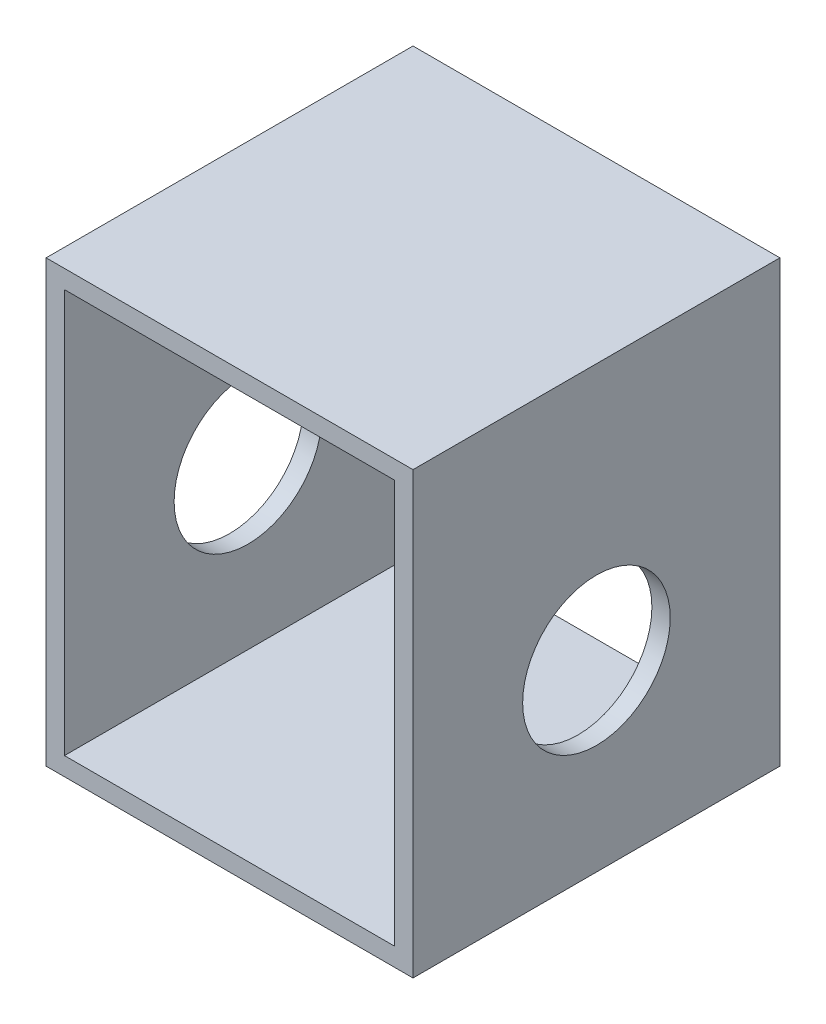
ISO-10303-21;
HEADER;
FILE_DESCRIPTION(('STEP AP214'),'2;1');
FILE_NAME('part.step','',(''),(''),'','','');
FILE_SCHEMA(('AUTOMOTIVE_DESIGN { 1 0 10303 214 1 1 1 1 }'));
ENDSEC;
DATA;
#1=APPLICATION_CONTEXT('core data for automotive mechanical design processes');
#2=APPLICATION_PROTOCOL_DEFINITION('international standard','automotive_design',2000,#1);
#3=PRODUCT_CONTEXT('',#1,'mechanical');
#4=PRODUCT('Part','Part','',(#3));
#5=PRODUCT_RELATED_PRODUCT_CATEGORY('part','',(#4));
#6=PRODUCT_DEFINITION_FORMATION('','',#4);
#7=PRODUCT_DEFINITION_CONTEXT('part definition',#1,'design');
#8=PRODUCT_DEFINITION('design','',#6,#7);
#9=PRODUCT_DEFINITION_SHAPE('','',#8);
#10=(LENGTH_UNIT() NAMED_UNIT(*) SI_UNIT(.MILLI.,.METRE.));
#11=(NAMED_UNIT(*) PLANE_ANGLE_UNIT() SI_UNIT($,.RADIAN.));
#12=(NAMED_UNIT(*) SI_UNIT($,.STERADIAN.) SOLID_ANGLE_UNIT());
#13=UNCERTAINTY_MEASURE_WITH_UNIT(LENGTH_MEASURE(1.E-05),#10,'distance_accuracy_value','');
#14=(GEOMETRIC_REPRESENTATION_CONTEXT(3) GLOBAL_UNCERTAINTY_ASSIGNED_CONTEXT((#13)) GLOBAL_UNIT_ASSIGNED_CONTEXT((#10,
#11,#12)) REPRESENTATION_CONTEXT('',''));
#15=CARTESIAN_POINT('',(0.,0.,0.));
#16=DIRECTION('',(0.,0.,1.));
#17=DIRECTION('',(1.,0.,0.));
#18=AXIS2_PLACEMENT_3D('',#15,#16,#17);
#19=CARTESIAN_POINT('',(0.,0.,63.5));
#20=DIRECTION('',(0.,0.,-1.));
#21=DIRECTION('',(-1.,0.,0.));
#22=AXIS2_PLACEMENT_3D('',#19,#20,#21);
#23=PLANE('',#22);
#24=DIRECTION('',(0.,-1.,0.));
#25=VECTOR('',#24,1.);
#26=CARTESIAN_POINT('',(0.,0.,63.5));
#27=LINE('',#26,#25);
#28=CARTESIAN_POINT('',(0.,76.2,63.5));
#29=VERTEX_POINT('',#28);
#30=CARTESIAN_POINT('',(0.,0.,63.5));
#31=VERTEX_POINT('',#30);
#32=EDGE_CURVE('E156',#29,#31,#27,.T.);
#33=ORIENTED_EDGE('',*,*,#32,.T.);
#34=DIRECTION('',(1.,0.,0.));
#35=VECTOR('',#34,1.);
#36=CARTESIAN_POINT('',(0.,0.,63.5));
#37=LINE('',#36,#35);
#38=CARTESIAN_POINT('',(63.5,0.,63.5));
#39=VERTEX_POINT('',#38);
#40=EDGE_CURVE('E160',#31,#39,#37,.T.);
#41=ORIENTED_EDGE('',*,*,#40,.T.);
#42=DIRECTION('',(0.,1.,0.));
#43=VECTOR('',#42,1.);
#44=CARTESIAN_POINT('',(63.5,0.,63.5));
#45=LINE('',#44,#43);
#46=CARTESIAN_POINT('',(63.5,76.2,63.5));
#47=VERTEX_POINT('',#46);
#48=EDGE_CURVE('E164',#39,#47,#45,.T.);
#49=ORIENTED_EDGE('',*,*,#48,.T.);
#50=DIRECTION('',(-1.,0.,0.));
#51=VECTOR('',#50,1.);
#52=CARTESIAN_POINT('',(0.,76.2,63.5));
#53=LINE('',#52,#51);
#54=EDGE_CURVE('E167',#47,#29,#53,.T.);
#55=ORIENTED_EDGE('',*,*,#54,.T.);
#56=EDGE_LOOP('',(#33,#41,#49,#55));
#57=FACE_BOUND('',#56,.T.);
#58=DIRECTION('',(0.,-1.,0.));
#59=VECTOR('',#58,1.);
#60=CARTESIAN_POINT('',(3.175,73.025,63.5));
#61=LINE('',#60,#59);
#62=CARTESIAN_POINT('',(3.175,73.025,63.5));
#63=VERTEX_POINT('',#62);
#64=CARTESIAN_POINT('',(3.17500000000001,3.175,63.5));
#65=VERTEX_POINT('',#64);
#66=EDGE_CURVE('E106',#63,#65,#61,.T.);
#67=ORIENTED_EDGE('',*,*,#66,.F.);
#68=DIRECTION('',(-1.,0.,0.));
#69=VECTOR('',#68,1.);
#70=CARTESIAN_POINT('',(3.175,73.025,63.5));
#71=LINE('',#70,#69);
#72=CARTESIAN_POINT('',(60.325,73.025,63.5));
#73=VERTEX_POINT('',#72);
#74=EDGE_CURVE('E132',#73,#63,#71,.T.);
#75=ORIENTED_EDGE('',*,*,#74,.F.);
#76=DIRECTION('',(0.,1.,0.));
#77=VECTOR('',#76,1.);
#78=CARTESIAN_POINT('',(60.325,73.025,63.5));
#79=LINE('',#78,#77);
#80=CARTESIAN_POINT('',(60.325,3.175,63.5));
#81=VERTEX_POINT('',#80);
#82=EDGE_CURVE('E128',#81,#73,#79,.T.);
#83=ORIENTED_EDGE('',*,*,#82,.F.);
#84=DIRECTION('',(1.,0.,0.));
#85=VECTOR('',#84,1.);
#86=CARTESIAN_POINT('',(3.17500000000001,3.175,63.5));
#87=LINE('',#86,#85);
#88=EDGE_CURVE('E115',#65,#81,#87,.T.);
#89=ORIENTED_EDGE('',*,*,#88,.F.);
#90=EDGE_LOOP('',(#67,#75,#83,#89));
#91=FACE_BOUND('',#90,.T.);
#92=ADVANCED_FACE('F39',(#57,#91),#23,.F.);
#93=CARTESIAN_POINT('',(0.,0.,0.));
#94=DIRECTION('',(0.,0.,-1.));
#95=DIRECTION('',(-1.,0.,0.));
#96=AXIS2_PLACEMENT_3D('',#93,#94,#95);
#97=PLANE('',#96);
#98=DIRECTION('',(0.,-1.,0.));
#99=VECTOR('',#98,1.);
#100=CARTESIAN_POINT('',(0.,0.,0.));
#101=LINE('',#100,#99);
#102=CARTESIAN_POINT('',(0.,76.2,0.));
#103=VERTEX_POINT('',#102);
#104=CARTESIAN_POINT('',(0.,0.,0.));
#105=VERTEX_POINT('',#104);
#106=EDGE_CURVE('E124',#103,#105,#101,.T.);
#107=ORIENTED_EDGE('',*,*,#106,.F.);
#108=DIRECTION('',(-1.,0.,0.));
#109=VECTOR('',#108,1.);
#110=CARTESIAN_POINT('',(0.,76.2,0.));
#111=LINE('',#110,#109);
#112=CARTESIAN_POINT('',(63.5,76.2,0.));
#113=VERTEX_POINT('',#112);
#114=EDGE_CURVE('E161',#113,#103,#111,.T.);
#115=ORIENTED_EDGE('',*,*,#114,.F.);
#116=DIRECTION('',(0.,1.,0.));
#117=VECTOR('',#116,1.);
#118=CARTESIAN_POINT('',(63.5,0.,0.));
#119=LINE('',#118,#117);
#120=CARTESIAN_POINT('',(63.5,0.,0.));
#121=VERTEX_POINT('',#120);
#122=EDGE_CURVE('E177',#121,#113,#119,.T.);
#123=ORIENTED_EDGE('',*,*,#122,.F.);
#124=DIRECTION('',(1.,0.,0.));
#125=VECTOR('',#124,1.);
#126=CARTESIAN_POINT('',(0.,0.,0.));
#127=LINE('',#126,#125);
#128=EDGE_CURVE('E174',#105,#121,#127,.T.);
#129=ORIENTED_EDGE('',*,*,#128,.F.);
#130=EDGE_LOOP('',(#107,#115,#123,#129));
#131=FACE_BOUND('',#130,.T.);
#132=DIRECTION('',(-1.,0.,0.));
#133=VECTOR('',#132,1.);
#134=CARTESIAN_POINT('',(3.175,73.025,0.));
#135=LINE('',#134,#133);
#136=CARTESIAN_POINT('',(60.325,73.025,0.));
#137=VERTEX_POINT('',#136);
#138=CARTESIAN_POINT('',(3.175,73.025,0.));
#139=VERTEX_POINT('',#138);
#140=EDGE_CURVE('E116',#137,#139,#135,.T.);
#141=ORIENTED_EDGE('',*,*,#140,.T.);
#142=DIRECTION('',(0.,-1.,0.));
#143=VECTOR('',#142,1.);
#144=CARTESIAN_POINT('',(3.175,73.025,0.));
#145=LINE('',#144,#143);
#146=CARTESIAN_POINT('',(3.17500000000001,3.175,0.));
#147=VERTEX_POINT('',#146);
#148=EDGE_CURVE('E64',#139,#147,#145,.T.);
#149=ORIENTED_EDGE('',*,*,#148,.T.);
#150=DIRECTION('',(1.,0.,0.));
#151=VECTOR('',#150,1.);
#152=CARTESIAN_POINT('',(3.17500000000001,3.175,0.));
#153=LINE('',#152,#151);
#154=CARTESIAN_POINT('',(60.325,3.175,0.));
#155=VERTEX_POINT('',#154);
#156=EDGE_CURVE('E122',#147,#155,#153,.T.);
#157=ORIENTED_EDGE('',*,*,#156,.T.);
#158=DIRECTION('',(0.,1.,0.));
#159=VECTOR('',#158,1.);
#160=CARTESIAN_POINT('',(60.325,73.025,0.));
#161=LINE('',#160,#159);
#162=EDGE_CURVE('E143',#155,#137,#161,.T.);
#163=ORIENTED_EDGE('',*,*,#162,.T.);
#164=EDGE_LOOP('',(#141,#149,#157,#163));
#165=FACE_BOUND('',#164,.T.);
#166=ADVANCED_FACE('F201',(#131,#165),#97,.T.);
#167=CARTESIAN_POINT('',(0.,0.,63.5));
#168=DIRECTION('',(1.,0.,0.));
#169=DIRECTION('',(0.,1.,0.));
#170=AXIS2_PLACEMENT_3D('',#167,#168,#169);
#171=PLANE('',#170);
#172=CARTESIAN_POINT('',(0.,31.75,31.75));
#173=DIRECTION('',(-1.,0.,0.));
#174=DIRECTION('',(0.,-1.,0.));
#175=AXIS2_PLACEMENT_3D('',#172,#173,#174);
#176=CIRCLE('',#175,12.7722232257058);
#177=CARTESIAN_POINT('',(0.,18.9777767742942,31.75));
#178=VERTEX_POINT('',#177);
#179=EDGE_CURVE('E246',#178,#178,#176,.T.);
#180=ORIENTED_EDGE('',*,*,#179,.F.);
#181=EDGE_LOOP('',(#180));
#182=FACE_BOUND('',#181,.T.);
#183=ORIENTED_EDGE('',*,*,#106,.T.);
#184=DIRECTION('',(0.,0.,-1.));
#185=VECTOR('',#184,1.);
#186=CARTESIAN_POINT('',(0.,0.,63.5));
#187=LINE('',#186,#185);
#188=EDGE_CURVE('E11',#31,#105,#187,.T.);
#189=ORIENTED_EDGE('',*,*,#188,.F.);
#190=ORIENTED_EDGE('',*,*,#32,.F.);
#191=DIRECTION('',(0.,0.,-1.));
#192=VECTOR('',#191,1.);
#193=CARTESIAN_POINT('',(0.,76.2,63.5));
#194=LINE('',#193,#192);
#195=EDGE_CURVE('E170',#29,#103,#194,.T.);
#196=ORIENTED_EDGE('',*,*,#195,.T.);
#197=EDGE_LOOP('',(#183,#189,#190,#196));
#198=FACE_BOUND('',#197,.T.);
#199=ADVANCED_FACE('F41',(#182,#198),#171,.F.);
#200=CARTESIAN_POINT('',(0.,0.,63.5));
#201=DIRECTION('',(0.,1.,0.));
#202=DIRECTION('',(0.,0.,1.));
#203=AXIS2_PLACEMENT_3D('',#200,#201,#202);
#204=PLANE('',#203);
#205=ORIENTED_EDGE('',*,*,#128,.T.);
#206=DIRECTION('',(0.,0.,-1.));
#207=VECTOR('',#206,1.);
#208=CARTESIAN_POINT('',(63.5,0.,63.5));
#209=LINE('',#208,#207);
#210=EDGE_CURVE('E49',#39,#121,#209,.T.);
#211=ORIENTED_EDGE('',*,*,#210,.F.);
#212=ORIENTED_EDGE('',*,*,#40,.F.);
#213=ORIENTED_EDGE('',*,*,#188,.T.);
#214=EDGE_LOOP('',(#205,#211,#212,#213));
#215=FACE_BOUND('',#214,.T.);
#216=ADVANCED_FACE('F211',(#215),#204,.F.);
#217=CARTESIAN_POINT('',(63.5,0.,63.5));
#218=DIRECTION('',(-1.,0.,0.));
#219=DIRECTION('',(0.,-1.,0.));
#220=AXIS2_PLACEMENT_3D('',#217,#218,#219);
#221=PLANE('',#220);
#222=CARTESIAN_POINT('',(63.5,31.75,31.75));
#223=DIRECTION('',(-1.,0.,0.));
#224=DIRECTION('',(0.,-1.,0.));
#225=AXIS2_PLACEMENT_3D('',#222,#223,#224);
#226=CIRCLE('',#225,12.7722232257058);
#227=CARTESIAN_POINT('',(63.5,18.9777767742943,31.75));
#228=VERTEX_POINT('',#227);
#229=EDGE_CURVE('E244',#228,#228,#226,.T.);
#230=ORIENTED_EDGE('',*,*,#229,.T.);
#231=EDGE_LOOP('',(#230));
#232=FACE_BOUND('',#231,.T.);
#233=ORIENTED_EDGE('',*,*,#122,.T.);
#234=DIRECTION('',(0.,0.,-1.));
#235=VECTOR('',#234,1.);
#236=CARTESIAN_POINT('',(63.5,76.2,63.5));
#237=LINE('',#236,#235);
#238=EDGE_CURVE('E185',#47,#113,#237,.T.);
#239=ORIENTED_EDGE('',*,*,#238,.F.);
#240=ORIENTED_EDGE('',*,*,#48,.F.);
#241=ORIENTED_EDGE('',*,*,#210,.T.);
#242=EDGE_LOOP('',(#233,#239,#240,#241));
#243=FACE_BOUND('',#242,.T.);
#244=ADVANCED_FACE('F195',(#232,#243),#221,.F.);
#245=CARTESIAN_POINT('',(0.,76.2,63.5));
#246=DIRECTION('',(0.,-1.,0.));
#247=DIRECTION('',(0.,0.,-1.));
#248=AXIS2_PLACEMENT_3D('',#245,#246,#247);
#249=PLANE('',#248);
#250=ORIENTED_EDGE('',*,*,#114,.T.);
#251=ORIENTED_EDGE('',*,*,#195,.F.);
#252=ORIENTED_EDGE('',*,*,#54,.F.);
#253=ORIENTED_EDGE('',*,*,#238,.T.);
#254=EDGE_LOOP('',(#250,#251,#252,#253));
#255=FACE_BOUND('',#254,.T.);
#256=ADVANCED_FACE('F205',(#255),#249,.F.);
#257=CARTESIAN_POINT('',(3.175,73.025,63.5));
#258=DIRECTION('',(1.,0.,0.));
#259=DIRECTION('',(0.,1.,0.));
#260=AXIS2_PLACEMENT_3D('',#257,#258,#259);
#261=PLANE('',#260);
#262=CARTESIAN_POINT('',(3.175,31.75,31.75));
#263=DIRECTION('',(1.,0.,0.));
#264=DIRECTION('',(0.,1.,0.));
#265=AXIS2_PLACEMENT_3D('',#262,#263,#264);
#266=CIRCLE('',#265,12.7722232257058);
#267=CARTESIAN_POINT('',(3.175,44.5222232257058,31.75));
#268=VERTEX_POINT('',#267);
#269=EDGE_CURVE('E140',#268,#268,#266,.T.);
#270=ORIENTED_EDGE('',*,*,#269,.F.);
#271=EDGE_LOOP('',(#270));
#272=FACE_BOUND('',#271,.T.);
#273=ORIENTED_EDGE('',*,*,#148,.F.);
#274=DIRECTION('',(0.,0.,-1.));
#275=VECTOR('',#274,1.);
#276=CARTESIAN_POINT('',(3.175,73.025,63.5));
#277=LINE('',#276,#275);
#278=EDGE_CURVE('E110',#63,#139,#277,.T.);
#279=ORIENTED_EDGE('',*,*,#278,.F.);
#280=ORIENTED_EDGE('',*,*,#66,.T.);
#281=DIRECTION('',(0.,0.,-1.));
#282=VECTOR('',#281,1.);
#283=CARTESIAN_POINT('',(3.17500000000001,3.175,63.5));
#284=LINE('',#283,#282);
#285=EDGE_CURVE('E109',#65,#147,#284,.T.);
#286=ORIENTED_EDGE('',*,*,#285,.T.);
#287=EDGE_LOOP('',(#273,#279,#280,#286));
#288=FACE_BOUND('',#287,.T.);
#289=ADVANCED_FACE('F108',(#272,#288),#261,.T.);
#290=CARTESIAN_POINT('',(3.17500000000001,3.175,63.5));
#291=DIRECTION('',(0.,1.,0.));
#292=DIRECTION('',(-1.,0.,0.));
#293=AXIS2_PLACEMENT_3D('',#290,#291,#292);
#294=PLANE('',#293);
#295=ORIENTED_EDGE('',*,*,#156,.F.);
#296=ORIENTED_EDGE('',*,*,#285,.F.);
#297=ORIENTED_EDGE('',*,*,#88,.T.);
#298=DIRECTION('',(0.,0.,-1.));
#299=VECTOR('',#298,1.);
#300=CARTESIAN_POINT('',(60.325,3.175,63.5));
#301=LINE('',#300,#299);
#302=EDGE_CURVE('E125',#81,#155,#301,.T.);
#303=ORIENTED_EDGE('',*,*,#302,.T.);
#304=EDGE_LOOP('',(#295,#296,#297,#303));
#305=FACE_BOUND('',#304,.T.);
#306=ADVANCED_FACE('F119',(#305),#294,.T.);
#307=CARTESIAN_POINT('',(60.325,73.025,63.5));
#308=DIRECTION('',(-1.,0.,0.));
#309=DIRECTION('',(0.,-1.,0.));
#310=AXIS2_PLACEMENT_3D('',#307,#308,#309);
#311=PLANE('',#310);
#312=CARTESIAN_POINT('',(60.325,31.75,31.75));
#313=DIRECTION('',(-1.,0.,0.));
#314=DIRECTION('',(0.,-1.,0.));
#315=AXIS2_PLACEMENT_3D('',#312,#313,#314);
#316=CIRCLE('',#315,12.7722232257058);
#317=CARTESIAN_POINT('',(60.325,18.9777767742943,31.75));
#318=VERTEX_POINT('',#317);
#319=EDGE_CURVE('E43',#318,#318,#316,.T.);
#320=ORIENTED_EDGE('',*,*,#319,.F.);
#321=EDGE_LOOP('',(#320));
#322=FACE_BOUND('',#321,.T.);
#323=ORIENTED_EDGE('',*,*,#162,.F.);
#324=ORIENTED_EDGE('',*,*,#302,.F.);
#325=ORIENTED_EDGE('',*,*,#82,.T.);
#326=DIRECTION('',(0.,0.,-1.));
#327=VECTOR('',#326,1.);
#328=CARTESIAN_POINT('',(60.325,73.025,63.5));
#329=LINE('',#328,#327);
#330=EDGE_CURVE('E56',#73,#137,#329,.T.);
#331=ORIENTED_EDGE('',*,*,#330,.T.);
#332=EDGE_LOOP('',(#323,#324,#325,#331));
#333=FACE_BOUND('',#332,.T.);
#334=ADVANCED_FACE('F237',(#322,#333),#311,.T.);
#335=CARTESIAN_POINT('',(3.175,73.025,63.5));
#336=DIRECTION('',(0.,-1.,0.));
#337=DIRECTION('',(0.,0.,-1.));
#338=AXIS2_PLACEMENT_3D('',#335,#336,#337);
#339=PLANE('',#338);
#340=ORIENTED_EDGE('',*,*,#140,.F.);
#341=ORIENTED_EDGE('',*,*,#330,.F.);
#342=ORIENTED_EDGE('',*,*,#74,.T.);
#343=ORIENTED_EDGE('',*,*,#278,.T.);
#344=EDGE_LOOP('',(#340,#341,#342,#343));
#345=FACE_BOUND('',#344,.T.);
#346=ADVANCED_FACE('F257',(#345),#339,.T.);
#347=CARTESIAN_POINT('',(63.5,31.75,31.75));
#348=DIRECTION('',(-1.,0.,0.));
#349=DIRECTION('',(0.,-1.,0.));
#350=AXIS2_PLACEMENT_3D('',#347,#348,#349);
#351=CYLINDRICAL_SURFACE('',#350,12.7722232257058);
#352=ORIENTED_EDGE('',*,*,#319,.T.);
#353=EDGE_LOOP('',(#352));
#354=FACE_BOUND('',#353,.T.);
#355=ORIENTED_EDGE('',*,*,#229,.F.);
#356=EDGE_LOOP('',(#355));
#357=FACE_BOUND('',#356,.T.);
#358=ADVANCED_FACE('F254',(#354,#357),#351,.F.);
#359=ORIENTED_EDGE('',*,*,#269,.T.);
#360=EDGE_LOOP('',(#359));
#361=FACE_BOUND('',#360,.T.);
#362=ORIENTED_EDGE('',*,*,#179,.T.);
#363=EDGE_LOOP('',(#362));
#364=FACE_BOUND('',#363,.T.);
#365=ADVANCED_FACE('F256',(#361,#364),#351,.F.);
#366=CLOSED_SHELL('',(#92,#166,#199,#216,#244,#256,#289,#306,#334,#346,#358,#365));
#367=MANIFOLD_SOLID_BREP('B2',#366);
#368=ADVANCED_BREP_SHAPE_REPRESENTATION('',(#18,#367),#14);
#369=SHAPE_DEFINITION_REPRESENTATION(#9,#368);
ENDSEC;
END-ISO-10303-21;
